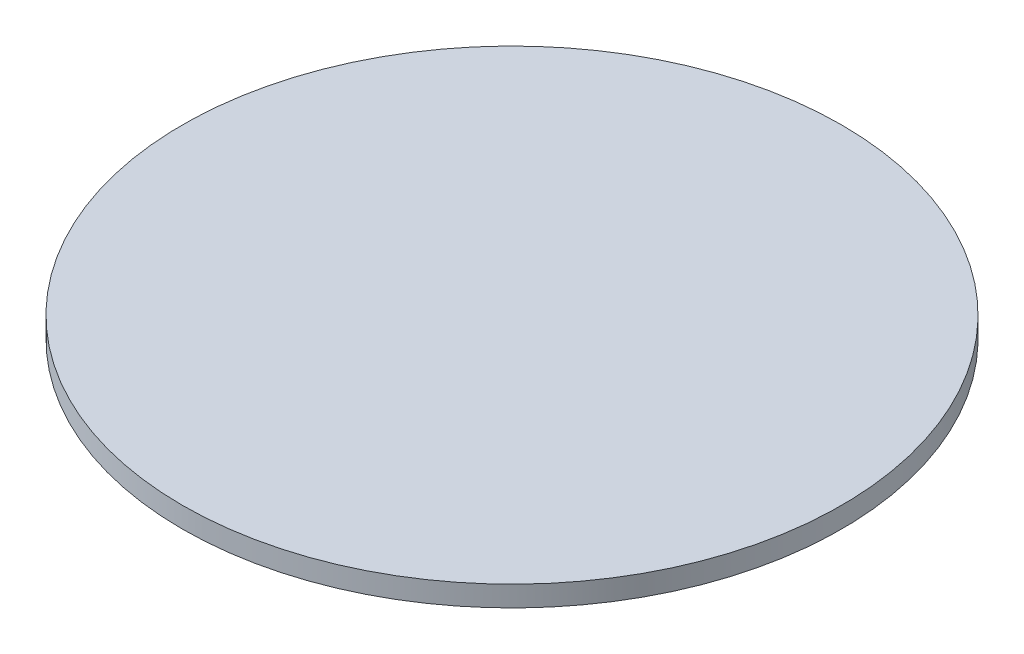
ISO-10303-21;
HEADER;
FILE_DESCRIPTION(('STEP AP214'),'2;1');
FILE_NAME('part.step','',(''),(''),'','','');
FILE_SCHEMA(('AUTOMOTIVE_DESIGN { 1 0 10303 214 1 1 1 1 }'));
ENDSEC;
DATA;
#1=APPLICATION_CONTEXT('core data for automotive mechanical design processes');
#2=APPLICATION_PROTOCOL_DEFINITION('international standard','automotive_design',2000,#1);
#3=PRODUCT_CONTEXT('',#1,'mechanical');
#4=PRODUCT('Part','Part','',(#3));
#5=PRODUCT_RELATED_PRODUCT_CATEGORY('part','',(#4));
#6=PRODUCT_DEFINITION_FORMATION('','',#4);
#7=PRODUCT_DEFINITION_CONTEXT('part definition',#1,'design');
#8=PRODUCT_DEFINITION('design','',#6,#7);
#9=PRODUCT_DEFINITION_SHAPE('','',#8);
#10=(LENGTH_UNIT() NAMED_UNIT(*) SI_UNIT(.MILLI.,.METRE.));
#11=(NAMED_UNIT(*) PLANE_ANGLE_UNIT() SI_UNIT($,.RADIAN.));
#12=(NAMED_UNIT(*) SI_UNIT($,.STERADIAN.) SOLID_ANGLE_UNIT());
#13=UNCERTAINTY_MEASURE_WITH_UNIT(LENGTH_MEASURE(1.E-05),#10,'distance_accuracy_value','');
#14=(GEOMETRIC_REPRESENTATION_CONTEXT(3) GLOBAL_UNCERTAINTY_ASSIGNED_CONTEXT((#13)) GLOBAL_UNIT_ASSIGNED_CONTEXT((#10,
#11,#12)) REPRESENTATION_CONTEXT('',''));
#15=CARTESIAN_POINT('',(0.,0.,0.));
#16=DIRECTION('',(0.,0.,1.));
#17=DIRECTION('',(1.,0.,0.));
#18=AXIS2_PLACEMENT_3D('',#15,#16,#17);
#19=CARTESIAN_POINT('',(0.,-20.,0.));
#20=DIRECTION('',(0.,1.,0.));
#21=DIRECTION('',(0.,0.,1.));
#22=AXIS2_PLACEMENT_3D('',#19,#20,#21);
#23=CYLINDRICAL_SURFACE('',#22,130.);
#24=CARTESIAN_POINT('',(0.,-20.,0.));
#25=DIRECTION('',(0.,1.,0.));
#26=DIRECTION('',(0.,0.,1.));
#27=AXIS2_PLACEMENT_3D('',#24,#25,#26);
#28=CIRCLE('',#27,130.);
#29=CARTESIAN_POINT('',(0.,-20.,130.));
#30=VERTEX_POINT('',#29);
#31=EDGE_CURVE('E10',#30,#30,#28,.T.);
#32=ORIENTED_EDGE('',*,*,#31,.T.);
#33=EDGE_LOOP('',(#32));
#34=FACE_BOUND('',#33,.T.);
#35=CARTESIAN_POINT('',(0.,0.,0.));
#36=DIRECTION('',(0.,1.,0.));
#37=DIRECTION('',(0.,0.,1.));
#38=AXIS2_PLACEMENT_3D('',#35,#36,#37);
#39=CIRCLE('',#38,130.);
#40=CARTESIAN_POINT('',(0.,0.,130.));
#41=VERTEX_POINT('',#40);
#42=EDGE_CURVE('E34',#41,#41,#39,.T.);
#43=ORIENTED_EDGE('',*,*,#42,.F.);
#44=EDGE_LOOP('',(#43));
#45=FACE_BOUND('',#44,.T.);
#46=ADVANCED_FACE('F31',(#34,#45),#23,.T.);
#47=CARTESIAN_POINT('',(0.,-20.,0.));
#48=DIRECTION('',(0.,1.,0.));
#49=DIRECTION('',(0.,0.,1.));
#50=AXIS2_PLACEMENT_3D('',#47,#48,#49);
#51=PLANE('',#50);
#52=ORIENTED_EDGE('',*,*,#31,.F.);
#53=EDGE_LOOP('',(#52));
#54=FACE_BOUND('',#53,.T.);
#55=ADVANCED_FACE('F54',(#54),#51,.F.);
#56=CARTESIAN_POINT('',(0.,10.,0.));
#57=DIRECTION('',(0.,-1.,0.));
#58=DIRECTION('',(0.,0.,-1.));
#59=AXIS2_PLACEMENT_3D('',#56,#57,#58);
#60=CYLINDRICAL_SURFACE('',#59,160.);
#61=CARTESIAN_POINT('',(0.,10.,0.));
#62=DIRECTION('',(0.,1.,0.));
#63=DIRECTION('',(0.,0.,1.));
#64=AXIS2_PLACEMENT_3D('',#61,#62,#63);
#65=CIRCLE('',#64,160.);
#66=CARTESIAN_POINT('',(0.,10.,160.));
#67=VERTEX_POINT('',#66);
#68=EDGE_CURVE('E41',#67,#67,#65,.T.);
#69=ORIENTED_EDGE('',*,*,#68,.F.);
#70=EDGE_LOOP('',(#69));
#71=FACE_BOUND('',#70,.T.);
#72=CARTESIAN_POINT('',(0.,0.,0.));
#73=DIRECTION('',(0.,1.,0.));
#74=DIRECTION('',(0.,0.,1.));
#75=AXIS2_PLACEMENT_3D('',#72,#73,#74);
#76=CIRCLE('',#75,160.);
#77=CARTESIAN_POINT('',(0.,0.,160.));
#78=VERTEX_POINT('',#77);
#79=EDGE_CURVE('E43',#78,#78,#76,.T.);
#80=ORIENTED_EDGE('',*,*,#79,.T.);
#81=EDGE_LOOP('',(#80));
#82=FACE_BOUND('',#81,.T.);
#83=ADVANCED_FACE('F51',(#71,#82),#60,.T.);
#84=CARTESIAN_POINT('',(0.,10.,0.));
#85=DIRECTION('',(0.,1.,0.));
#86=DIRECTION('',(0.,0.,1.));
#87=AXIS2_PLACEMENT_3D('',#84,#85,#86);
#88=PLANE('',#87);
#89=ORIENTED_EDGE('',*,*,#68,.T.);
#90=EDGE_LOOP('',(#89));
#91=FACE_BOUND('',#90,.T.);
#92=ADVANCED_FACE('F49',(#91),#88,.T.);
#93=CARTESIAN_POINT('',(0.,0.,0.));
#94=DIRECTION('',(0.,1.,0.));
#95=DIRECTION('',(0.,0.,1.));
#96=AXIS2_PLACEMENT_3D('',#93,#94,#95);
#97=PLANE('',#96);
#98=ORIENTED_EDGE('',*,*,#42,.T.);
#99=EDGE_LOOP('',(#98));
#100=FACE_BOUND('',#99,.T.);
#101=ORIENTED_EDGE('',*,*,#79,.F.);
#102=EDGE_LOOP('',(#101));
#103=FACE_BOUND('',#102,.T.);
#104=ADVANCED_FACE('F58',(#100,#103),#97,.F.);
#105=CLOSED_SHELL('',(#46,#55,#83,#92,#104));
#106=MANIFOLD_SOLID_BREP('B2',#105);
#107=ADVANCED_BREP_SHAPE_REPRESENTATION('',(#18,#106),#14);
#108=SHAPE_DEFINITION_REPRESENTATION(#9,#107);
ENDSEC;
END-ISO-10303-21;
